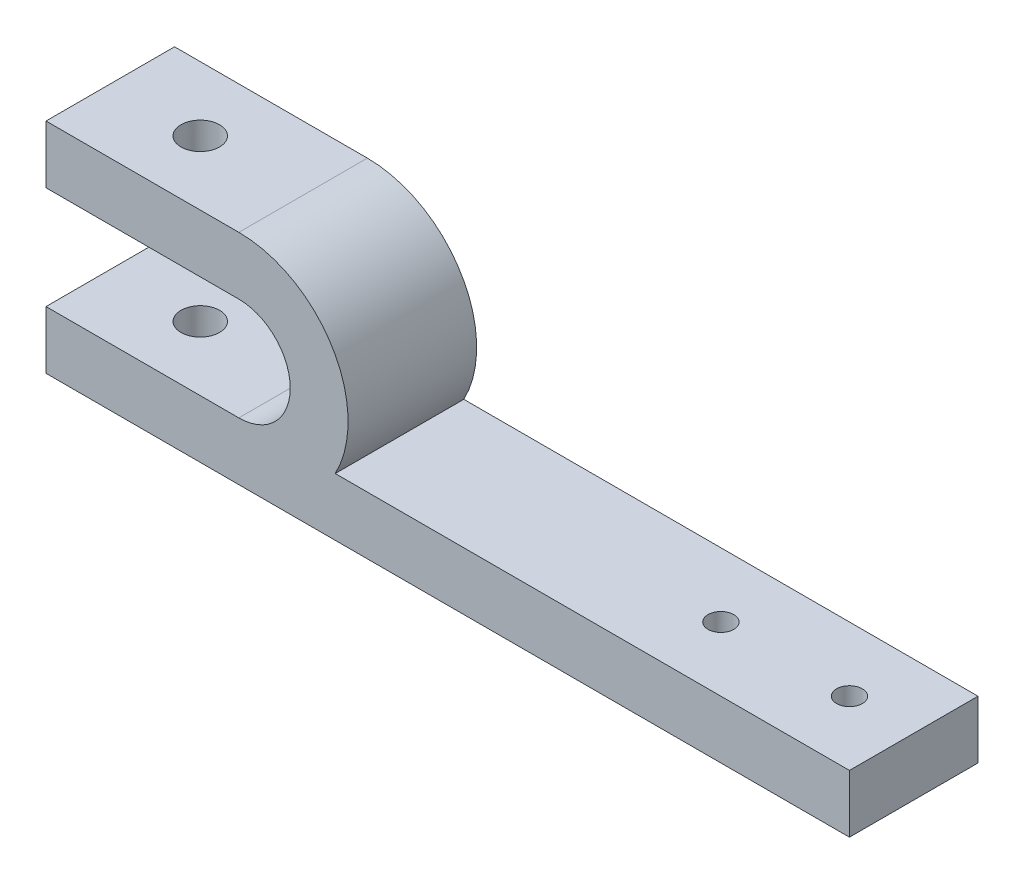
ISO-10303-21;
HEADER;
FILE_DESCRIPTION(('STEP AP214'),'2;1');
FILE_NAME('part.step','',(''),(''),'','','');
FILE_SCHEMA(('AUTOMOTIVE_DESIGN { 1 0 10303 214 1 1 1 1 }'));
ENDSEC;
DATA;
#1=APPLICATION_CONTEXT('core data for automotive mechanical design processes');
#2=APPLICATION_PROTOCOL_DEFINITION('international standard','automotive_design',2000,#1);
#3=PRODUCT_CONTEXT('',#1,'mechanical');
#4=PRODUCT('Part','Part','',(#3));
#5=PRODUCT_RELATED_PRODUCT_CATEGORY('part','',(#4));
#6=PRODUCT_DEFINITION_FORMATION('','',#4);
#7=PRODUCT_DEFINITION_CONTEXT('part definition',#1,'design');
#8=PRODUCT_DEFINITION('design','',#6,#7);
#9=PRODUCT_DEFINITION_SHAPE('','',#8);
#10=(LENGTH_UNIT() NAMED_UNIT(*) SI_UNIT(.MILLI.,.METRE.));
#11=(NAMED_UNIT(*) PLANE_ANGLE_UNIT() SI_UNIT($,.RADIAN.));
#12=(NAMED_UNIT(*) SI_UNIT($,.STERADIAN.) SOLID_ANGLE_UNIT());
#13=UNCERTAINTY_MEASURE_WITH_UNIT(LENGTH_MEASURE(1.E-05),#10,'distance_accuracy_value','');
#14=(GEOMETRIC_REPRESENTATION_CONTEXT(3) GLOBAL_UNCERTAINTY_ASSIGNED_CONTEXT((#13)) GLOBAL_UNIT_ASSIGNED_CONTEXT((#10,
#11,#12)) REPRESENTATION_CONTEXT('',''));
#15=CARTESIAN_POINT('',(0.,0.,0.));
#16=DIRECTION('',(0.,0.,1.));
#17=DIRECTION('',(1.,0.,0.));
#18=AXIS2_PLACEMENT_3D('',#15,#16,#17);
#19=CARTESIAN_POINT('',(0.,0.,10.));
#20=DIRECTION('',(0.,0.,-1.));
#21=DIRECTION('',(-1.,0.,0.));
#22=AXIS2_PLACEMENT_3D('',#19,#20,#21);
#23=CYLINDRICAL_SURFACE('',#22,8.5);
#24=CARTESIAN_POINT('',(0.,0.,0.));
#25=DIRECTION('',(0.,0.,1.));
#26=DIRECTION('',(1.,0.,0.));
#27=AXIS2_PLACEMENT_3D('',#24,#25,#26);
#28=CIRCLE('',#27,8.5);
#29=CARTESIAN_POINT('',(7.5,-4.,0.));
#30=VERTEX_POINT('',#29);
#31=CARTESIAN_POINT('',(0.,8.5,0.));
#32=VERTEX_POINT('',#31);
#33=EDGE_CURVE('E145',#30,#32,#28,.T.);
#34=ORIENTED_EDGE('',*,*,#33,.T.);
#35=DIRECTION('',(0.,0.,-1.));
#36=VECTOR('',#35,1.);
#37=CARTESIAN_POINT('',(0.,8.5,10.));
#38=LINE('',#37,#36);
#39=CARTESIAN_POINT('',(0.,8.5,10.));
#40=VERTEX_POINT('',#39);
#41=EDGE_CURVE('E11',#40,#32,#38,.T.);
#42=ORIENTED_EDGE('',*,*,#41,.F.);
#43=CARTESIAN_POINT('',(0.,0.,10.));
#44=DIRECTION('',(0.,0.,1.));
#45=DIRECTION('',(1.,0.,0.));
#46=AXIS2_PLACEMENT_3D('',#43,#44,#45);
#47=CIRCLE('',#46,8.5);
#48=CARTESIAN_POINT('',(7.5,-4.,10.));
#49=VERTEX_POINT('',#48);
#50=EDGE_CURVE('E164',#49,#40,#47,.T.);
#51=ORIENTED_EDGE('',*,*,#50,.F.);
#52=DIRECTION('',(0.,0.,-1.));
#53=VECTOR('',#52,1.);
#54=CARTESIAN_POINT('',(7.5,-4.,10.));
#55=LINE('',#54,#53);
#56=EDGE_CURVE('E141',#49,#30,#55,.T.);
#57=ORIENTED_EDGE('',*,*,#56,.T.);
#58=EDGE_LOOP('',(#34,#42,#51,#57));
#59=FACE_BOUND('',#58,.T.);
#60=ADVANCED_FACE('F35',(#59),#23,.T.);
#61=CARTESIAN_POINT('',(-15.,8.5,10.));
#62=DIRECTION('',(0.,-1.,0.));
#63=DIRECTION('',(0.,0.,-1.));
#64=AXIS2_PLACEMENT_3D('',#61,#62,#63);
#65=PLANE('',#64);
#66=CARTESIAN_POINT('',(-8.,8.5,5.));
#67=DIRECTION('',(0.,-1.,0.));
#68=DIRECTION('',(1.,0.,0.));
#69=AXIS2_PLACEMENT_3D('',#66,#67,#68);
#70=CIRCLE('',#69,1.5);
#71=CARTESIAN_POINT('',(-6.5,8.5,5.));
#72=VERTEX_POINT('',#71);
#73=EDGE_CURVE('E275',#72,#72,#70,.T.);
#74=ORIENTED_EDGE('',*,*,#73,.T.);
#75=EDGE_LOOP('',(#74));
#76=FACE_BOUND('',#75,.T.);
#77=DIRECTION('',(-1.,0.,0.));
#78=VECTOR('',#77,1.);
#79=CARTESIAN_POINT('',(-15.,8.5,0.));
#80=LINE('',#79,#78);
#81=CARTESIAN_POINT('',(-15.,8.5,0.));
#82=VERTEX_POINT('',#81);
#83=EDGE_CURVE('E148',#32,#82,#80,.T.);
#84=ORIENTED_EDGE('',*,*,#83,.T.);
#85=DIRECTION('',(0.,0.,-1.));
#86=VECTOR('',#85,1.);
#87=CARTESIAN_POINT('',(-15.,8.5,10.));
#88=LINE('',#87,#86);
#89=CARTESIAN_POINT('',(-15.,8.5,10.));
#90=VERTEX_POINT('',#89);
#91=EDGE_CURVE('E44',#90,#82,#88,.T.);
#92=ORIENTED_EDGE('',*,*,#91,.F.);
#93=DIRECTION('',(-1.,0.,0.));
#94=VECTOR('',#93,1.);
#95=CARTESIAN_POINT('',(-15.,8.5,10.));
#96=LINE('',#95,#94);
#97=EDGE_CURVE('E102',#40,#90,#96,.T.);
#98=ORIENTED_EDGE('',*,*,#97,.F.);
#99=ORIENTED_EDGE('',*,*,#41,.T.);
#100=EDGE_LOOP('',(#84,#92,#98,#99));
#101=FACE_BOUND('',#100,.T.);
#102=ADVANCED_FACE('F232',(#76,#101),#65,.F.);
#103=CARTESIAN_POINT('',(-15.,4.,10.));
#104=DIRECTION('',(1.,0.,0.));
#105=DIRECTION('',(0.,0.,-1.));
#106=AXIS2_PLACEMENT_3D('',#103,#104,#105);
#107=PLANE('',#106);
#108=DIRECTION('',(0.,-1.,0.));
#109=VECTOR('',#108,1.);
#110=CARTESIAN_POINT('',(-15.,4.,0.));
#111=LINE('',#110,#109);
#112=CARTESIAN_POINT('',(-15.,4.,0.));
#113=VERTEX_POINT('',#112);
#114=EDGE_CURVE('E151',#82,#113,#111,.T.);
#115=ORIENTED_EDGE('',*,*,#114,.T.);
#116=DIRECTION('',(0.,0.,-1.));
#117=VECTOR('',#116,1.);
#118=CARTESIAN_POINT('',(-15.,4.,10.));
#119=LINE('',#118,#117);
#120=CARTESIAN_POINT('',(-15.,4.,10.));
#121=VERTEX_POINT('',#120);
#122=EDGE_CURVE('E177',#121,#113,#119,.T.);
#123=ORIENTED_EDGE('',*,*,#122,.F.);
#124=DIRECTION('',(0.,-1.,0.));
#125=VECTOR('',#124,1.);
#126=CARTESIAN_POINT('',(-15.,4.,10.));
#127=LINE('',#126,#125);
#128=EDGE_CURVE('E196',#90,#121,#127,.T.);
#129=ORIENTED_EDGE('',*,*,#128,.F.);
#130=ORIENTED_EDGE('',*,*,#91,.T.);
#131=EDGE_LOOP('',(#115,#123,#129,#130));
#132=FACE_BOUND('',#131,.T.);
#133=ADVANCED_FACE('F236',(#132),#107,.F.);
#134=CARTESIAN_POINT('',(0.,4.,10.));
#135=DIRECTION('',(0.,1.,0.));
#136=DIRECTION('',(-1.,0.,0.));
#137=AXIS2_PLACEMENT_3D('',#134,#135,#136);
#138=PLANE('',#137);
#139=CARTESIAN_POINT('',(-8.,4.,5.));
#140=DIRECTION('',(0.,1.,0.));
#141=DIRECTION('',(-1.,0.,0.));
#142=AXIS2_PLACEMENT_3D('',#139,#140,#141);
#143=CIRCLE('',#142,1.5);
#144=CARTESIAN_POINT('',(-9.5,4.,5.));
#145=VERTEX_POINT('',#144);
#146=EDGE_CURVE('E270',#145,#145,#143,.T.);
#147=ORIENTED_EDGE('',*,*,#146,.T.);
#148=EDGE_LOOP('',(#147));
#149=FACE_BOUND('',#148,.T.);
#150=DIRECTION('',(1.,0.,0.));
#151=VECTOR('',#150,1.);
#152=CARTESIAN_POINT('',(0.,4.,0.));
#153=LINE('',#152,#151);
#154=CARTESIAN_POINT('',(0.,4.,0.));
#155=VERTEX_POINT('',#154);
#156=EDGE_CURVE('E153',#113,#155,#153,.T.);
#157=ORIENTED_EDGE('',*,*,#156,.T.);
#158=DIRECTION('',(0.,0.,-1.));
#159=VECTOR('',#158,1.);
#160=CARTESIAN_POINT('',(0.,4.,10.));
#161=LINE('',#160,#159);
#162=CARTESIAN_POINT('',(0.,4.,10.));
#163=VERTEX_POINT('',#162);
#164=EDGE_CURVE('E174',#163,#155,#161,.T.);
#165=ORIENTED_EDGE('',*,*,#164,.F.);
#166=DIRECTION('',(1.,0.,0.));
#167=VECTOR('',#166,1.);
#168=CARTESIAN_POINT('',(0.,4.,10.));
#169=LINE('',#168,#167);
#170=EDGE_CURVE('E198',#121,#163,#169,.T.);
#171=ORIENTED_EDGE('',*,*,#170,.F.);
#172=ORIENTED_EDGE('',*,*,#122,.T.);
#173=EDGE_LOOP('',(#157,#165,#171,#172));
#174=FACE_BOUND('',#173,.T.);
#175=ADVANCED_FACE('F241',(#149,#174),#138,.F.);
#176=CARTESIAN_POINT('',(0.,0.,10.));
#177=DIRECTION('',(0.,0.,-1.));
#178=DIRECTION('',(-1.,0.,0.));
#179=AXIS2_PLACEMENT_3D('',#176,#177,#178);
#180=CYLINDRICAL_SURFACE('',#179,4.);
#181=CARTESIAN_POINT('',(0.,0.,0.));
#182=DIRECTION('',(0.,0.,-1.));
#183=DIRECTION('',(1.,0.,0.));
#184=AXIS2_PLACEMENT_3D('',#181,#182,#183);
#185=CIRCLE('',#184,4.);
#186=CARTESIAN_POINT('',(0.,-4.,0.));
#187=VERTEX_POINT('',#186);
#188=EDGE_CURVE('E155',#155,#187,#185,.T.);
#189=ORIENTED_EDGE('',*,*,#188,.T.);
#190=DIRECTION('',(0.,0.,-1.));
#191=VECTOR('',#190,1.);
#192=CARTESIAN_POINT('',(0.,-4.,10.));
#193=LINE('',#192,#191);
#194=CARTESIAN_POINT('',(0.,-4.,10.));
#195=VERTEX_POINT('',#194);
#196=EDGE_CURVE('E171',#195,#187,#193,.T.);
#197=ORIENTED_EDGE('',*,*,#196,.F.);
#198=CARTESIAN_POINT('',(0.,0.,10.));
#199=DIRECTION('',(0.,0.,-1.));
#200=DIRECTION('',(1.,0.,0.));
#201=AXIS2_PLACEMENT_3D('',#198,#199,#200);
#202=CIRCLE('',#201,4.);
#203=EDGE_CURVE('E200',#163,#195,#202,.T.);
#204=ORIENTED_EDGE('',*,*,#203,.F.);
#205=ORIENTED_EDGE('',*,*,#164,.T.);
#206=EDGE_LOOP('',(#189,#197,#204,#205));
#207=FACE_BOUND('',#206,.T.);
#208=ADVANCED_FACE('F248',(#207),#180,.F.);
#209=CARTESIAN_POINT('',(-15.,-4.,10.));
#210=DIRECTION('',(0.,-1.,0.));
#211=DIRECTION('',(0.,0.,-1.));
#212=AXIS2_PLACEMENT_3D('',#209,#210,#211);
#213=PLANE('',#212);
#214=CARTESIAN_POINT('',(-8.,-4.,5.));
#215=DIRECTION('',(0.,-1.,0.));
#216=DIRECTION('',(0.,0.,-1.));
#217=AXIS2_PLACEMENT_3D('',#214,#215,#216);
#218=CIRCLE('',#217,1.5);
#219=CARTESIAN_POINT('',(-8.,-4.,3.5));
#220=VERTEX_POINT('',#219);
#221=EDGE_CURVE('E272',#220,#220,#218,.T.);
#222=ORIENTED_EDGE('',*,*,#221,.T.);
#223=EDGE_LOOP('',(#222));
#224=FACE_BOUND('',#223,.T.);
#225=DIRECTION('',(-1.,0.,0.));
#226=VECTOR('',#225,1.);
#227=CARTESIAN_POINT('',(-15.,-4.,0.));
#228=LINE('',#227,#226);
#229=CARTESIAN_POINT('',(-15.,-4.,0.));
#230=VERTEX_POINT('',#229);
#231=EDGE_CURVE('E157',#187,#230,#228,.T.);
#232=ORIENTED_EDGE('',*,*,#231,.T.);
#233=DIRECTION('',(0.,0.,-1.));
#234=VECTOR('',#233,1.);
#235=CARTESIAN_POINT('',(-15.,-4.,10.));
#236=LINE('',#235,#234);
#237=CARTESIAN_POINT('',(-15.,-4.,10.));
#238=VERTEX_POINT('',#237);
#239=EDGE_CURVE('E168',#238,#230,#236,.T.);
#240=ORIENTED_EDGE('',*,*,#239,.F.);
#241=DIRECTION('',(-1.,0.,0.));
#242=VECTOR('',#241,1.);
#243=CARTESIAN_POINT('',(-15.,-4.,10.));
#244=LINE('',#243,#242);
#245=EDGE_CURVE('E202',#195,#238,#244,.T.);
#246=ORIENTED_EDGE('',*,*,#245,.F.);
#247=ORIENTED_EDGE('',*,*,#196,.T.);
#248=EDGE_LOOP('',(#232,#240,#246,#247));
#249=FACE_BOUND('',#248,.T.);
#250=ADVANCED_FACE('F208',(#224,#249),#213,.F.);
#251=CARTESIAN_POINT('',(-15.,-8.5,10.));
#252=DIRECTION('',(1.,0.,0.));
#253=DIRECTION('',(0.,0.,-1.));
#254=AXIS2_PLACEMENT_3D('',#251,#252,#253);
#255=PLANE('',#254);
#256=DIRECTION('',(0.,-1.,0.));
#257=VECTOR('',#256,1.);
#258=CARTESIAN_POINT('',(-15.,-8.5,0.));
#259=LINE('',#258,#257);
#260=CARTESIAN_POINT('',(-15.,-8.5,0.));
#261=VERTEX_POINT('',#260);
#262=EDGE_CURVE('E159',#230,#261,#259,.T.);
#263=ORIENTED_EDGE('',*,*,#262,.T.);
#264=DIRECTION('',(0.,0.,-1.));
#265=VECTOR('',#264,1.);
#266=CARTESIAN_POINT('',(-15.,-8.5,10.));
#267=LINE('',#266,#265);
#268=CARTESIAN_POINT('',(-15.,-8.5,10.));
#269=VERTEX_POINT('',#268);
#270=EDGE_CURVE('E136',#269,#261,#267,.T.);
#271=ORIENTED_EDGE('',*,*,#270,.F.);
#272=DIRECTION('',(0.,-1.,0.));
#273=VECTOR('',#272,1.);
#274=CARTESIAN_POINT('',(-15.,-8.5,10.));
#275=LINE('',#274,#273);
#276=EDGE_CURVE('E127',#238,#269,#275,.T.);
#277=ORIENTED_EDGE('',*,*,#276,.F.);
#278=ORIENTED_EDGE('',*,*,#239,.T.);
#279=EDGE_LOOP('',(#263,#271,#277,#278));
#280=FACE_BOUND('',#279,.T.);
#281=ADVANCED_FACE('F212',(#280),#255,.F.);
#282=CARTESIAN_POINT('',(47.5,-8.49999999999999,10.));
#283=DIRECTION('',(0.,1.,0.));
#284=DIRECTION('',(-1.,0.,0.));
#285=AXIS2_PLACEMENT_3D('',#282,#283,#284);
#286=PLANE('',#285);
#287=CARTESIAN_POINT('',(-8.,-8.5,5.));
#288=DIRECTION('',(0.,-1.,0.));
#289=DIRECTION('',(1.,0.,0.));
#290=AXIS2_PLACEMENT_3D('',#287,#288,#289);
#291=CIRCLE('',#290,1.5);
#292=CARTESIAN_POINT('',(-6.5,-8.5,5.));
#293=VERTEX_POINT('',#292);
#294=EDGE_CURVE('E265',#293,#293,#291,.T.);
#295=ORIENTED_EDGE('',*,*,#294,.F.);
#296=EDGE_LOOP('',(#295));
#297=FACE_BOUND('',#296,.T.);
#298=CARTESIAN_POINT('',(32.5,-8.5,5.));
#299=DIRECTION('',(0.,-1.,0.));
#300=DIRECTION('',(1.,0.,0.));
#301=AXIS2_PLACEMENT_3D('',#298,#299,#300);
#302=CIRCLE('',#301,0.999999999999998);
#303=CARTESIAN_POINT('',(33.5,-8.5,5.));
#304=VERTEX_POINT('',#303);
#305=EDGE_CURVE('E190',#304,#304,#302,.T.);
#306=ORIENTED_EDGE('',*,*,#305,.F.);
#307=EDGE_LOOP('',(#306));
#308=FACE_BOUND('',#307,.T.);
#309=CARTESIAN_POINT('',(42.5,-8.5,5.));
#310=DIRECTION('',(0.,-1.,0.));
#311=DIRECTION('',(1.,0.,0.));
#312=AXIS2_PLACEMENT_3D('',#309,#310,#311);
#313=CIRCLE('',#312,0.999999999999998);
#314=CARTESIAN_POINT('',(43.5,-8.5,5.));
#315=VERTEX_POINT('',#314);
#316=EDGE_CURVE('E182',#315,#315,#313,.T.);
#317=ORIENTED_EDGE('',*,*,#316,.F.);
#318=EDGE_LOOP('',(#317));
#319=FACE_BOUND('',#318,.T.);
#320=DIRECTION('',(1.,0.,0.));
#321=VECTOR('',#320,1.);
#322=CARTESIAN_POINT('',(47.5,-8.49999999999999,0.));
#323=LINE('',#322,#321);
#324=CARTESIAN_POINT('',(47.5,-8.49999999999999,0.));
#325=VERTEX_POINT('',#324);
#326=EDGE_CURVE('E135',#261,#325,#323,.T.);
#327=ORIENTED_EDGE('',*,*,#326,.T.);
#328=DIRECTION('',(0.,0.,-1.));
#329=VECTOR('',#328,1.);
#330=CARTESIAN_POINT('',(47.5,-8.49999999999999,10.));
#331=LINE('',#330,#329);
#332=CARTESIAN_POINT('',(47.5,-8.49999999999999,10.));
#333=VERTEX_POINT('',#332);
#334=EDGE_CURVE('E132',#333,#325,#331,.T.);
#335=ORIENTED_EDGE('',*,*,#334,.F.);
#336=DIRECTION('',(1.,0.,0.));
#337=VECTOR('',#336,1.);
#338=CARTESIAN_POINT('',(47.5,-8.49999999999999,10.));
#339=LINE('',#338,#337);
#340=EDGE_CURVE('E121',#269,#333,#339,.T.);
#341=ORIENTED_EDGE('',*,*,#340,.F.);
#342=ORIENTED_EDGE('',*,*,#270,.T.);
#343=EDGE_LOOP('',(#327,#335,#341,#342));
#344=FACE_BOUND('',#343,.T.);
#345=ADVANCED_FACE('F133',(#297,#308,#319,#344),#286,.F.);
#346=CARTESIAN_POINT('',(47.5,-4.,10.));
#347=DIRECTION('',(-1.,0.,0.));
#348=DIRECTION('',(0.,0.,1.));
#349=AXIS2_PLACEMENT_3D('',#346,#347,#348);
#350=PLANE('',#349);
#351=DIRECTION('',(0.,1.,0.));
#352=VECTOR('',#351,1.);
#353=CARTESIAN_POINT('',(47.5,-4.,0.));
#354=LINE('',#353,#352);
#355=CARTESIAN_POINT('',(47.5,-4.,0.));
#356=VERTEX_POINT('',#355);
#357=EDGE_CURVE('E88',#325,#356,#354,.T.);
#358=ORIENTED_EDGE('',*,*,#357,.T.);
#359=DIRECTION('',(0.,0.,-1.));
#360=VECTOR('',#359,1.);
#361=CARTESIAN_POINT('',(47.5,-4.,10.));
#362=LINE('',#361,#360);
#363=CARTESIAN_POINT('',(47.5,-4.,10.));
#364=VERTEX_POINT('',#363);
#365=EDGE_CURVE('E137',#364,#356,#362,.T.);
#366=ORIENTED_EDGE('',*,*,#365,.F.);
#367=DIRECTION('',(0.,1.,0.));
#368=VECTOR('',#367,1.);
#369=CARTESIAN_POINT('',(47.5,-4.,10.));
#370=LINE('',#369,#368);
#371=EDGE_CURVE('E125',#333,#364,#370,.T.);
#372=ORIENTED_EDGE('',*,*,#371,.F.);
#373=ORIENTED_EDGE('',*,*,#334,.T.);
#374=EDGE_LOOP('',(#358,#366,#372,#373));
#375=FACE_BOUND('',#374,.T.);
#376=ADVANCED_FACE('F139',(#375),#350,.F.);
#377=CARTESIAN_POINT('',(7.5,-4.,10.));
#378=DIRECTION('',(0.,-1.,0.));
#379=DIRECTION('',(0.,0.,-1.));
#380=AXIS2_PLACEMENT_3D('',#377,#378,#379);
#381=PLANE('',#380);
#382=CARTESIAN_POINT('',(32.5,-4.,5.));
#383=DIRECTION('',(0.,-1.,0.));
#384=DIRECTION('',(0.,0.,-1.));
#385=AXIS2_PLACEMENT_3D('',#382,#383,#384);
#386=CIRCLE('',#385,0.999999999999998);
#387=CARTESIAN_POINT('',(32.5,-4.,4.));
#388=VERTEX_POINT('',#387);
#389=EDGE_CURVE('E38',#388,#388,#386,.T.);
#390=ORIENTED_EDGE('',*,*,#389,.T.);
#391=EDGE_LOOP('',(#390));
#392=FACE_BOUND('',#391,.T.);
#393=CARTESIAN_POINT('',(42.5,-4.,5.));
#394=DIRECTION('',(0.,-1.,0.));
#395=DIRECTION('',(0.,0.,-1.));
#396=AXIS2_PLACEMENT_3D('',#393,#394,#395);
#397=CIRCLE('',#396,0.999999999999998);
#398=CARTESIAN_POINT('',(42.5,-4.,4.));
#399=VERTEX_POINT('',#398);
#400=EDGE_CURVE('E149',#399,#399,#397,.T.);
#401=ORIENTED_EDGE('',*,*,#400,.T.);
#402=EDGE_LOOP('',(#401));
#403=FACE_BOUND('',#402,.T.);
#404=DIRECTION('',(-1.,0.,0.));
#405=VECTOR('',#404,1.);
#406=CARTESIAN_POINT('',(7.5,-4.,0.));
#407=LINE('',#406,#405);
#408=EDGE_CURVE('E94',#356,#30,#407,.T.);
#409=ORIENTED_EDGE('',*,*,#408,.T.);
#410=ORIENTED_EDGE('',*,*,#56,.F.);
#411=DIRECTION('',(-1.,0.,0.));
#412=VECTOR('',#411,1.);
#413=CARTESIAN_POINT('',(7.5,-4.,10.));
#414=LINE('',#413,#412);
#415=EDGE_CURVE('E53',#364,#49,#414,.T.);
#416=ORIENTED_EDGE('',*,*,#415,.F.);
#417=ORIENTED_EDGE('',*,*,#365,.T.);
#418=EDGE_LOOP('',(#409,#410,#416,#417));
#419=FACE_BOUND('',#418,.T.);
#420=ADVANCED_FACE('F220',(#392,#403,#419),#381,.F.);
#421=CARTESIAN_POINT('',(0.,0.,10.));
#422=DIRECTION('',(0.,0.,1.));
#423=DIRECTION('',(1.,0.,0.));
#424=AXIS2_PLACEMENT_3D('',#421,#422,#423);
#425=PLANE('',#424);
#426=ORIENTED_EDGE('',*,*,#50,.T.);
#427=ORIENTED_EDGE('',*,*,#97,.T.);
#428=ORIENTED_EDGE('',*,*,#128,.T.);
#429=ORIENTED_EDGE('',*,*,#170,.T.);
#430=ORIENTED_EDGE('',*,*,#203,.T.);
#431=ORIENTED_EDGE('',*,*,#245,.T.);
#432=ORIENTED_EDGE('',*,*,#276,.T.);
#433=ORIENTED_EDGE('',*,*,#340,.T.);
#434=ORIENTED_EDGE('',*,*,#371,.T.);
#435=ORIENTED_EDGE('',*,*,#415,.T.);
#436=EDGE_LOOP('',(#426,#427,#428,#429,#430,#431,#432,#433,#434,#435));
#437=FACE_BOUND('',#436,.T.);
#438=ADVANCED_FACE('F123',(#437),#425,.T.);
#439=CARTESIAN_POINT('',(0.,0.,0.));
#440=DIRECTION('',(0.,0.,1.));
#441=DIRECTION('',(1.,0.,0.));
#442=AXIS2_PLACEMENT_3D('',#439,#440,#441);
#443=PLANE('',#442);
#444=ORIENTED_EDGE('',*,*,#33,.F.);
#445=ORIENTED_EDGE('',*,*,#408,.F.);
#446=ORIENTED_EDGE('',*,*,#357,.F.);
#447=ORIENTED_EDGE('',*,*,#326,.F.);
#448=ORIENTED_EDGE('',*,*,#262,.F.);
#449=ORIENTED_EDGE('',*,*,#231,.F.);
#450=ORIENTED_EDGE('',*,*,#188,.F.);
#451=ORIENTED_EDGE('',*,*,#156,.F.);
#452=ORIENTED_EDGE('',*,*,#114,.F.);
#453=ORIENTED_EDGE('',*,*,#83,.F.);
#454=EDGE_LOOP('',(#444,#445,#446,#447,#448,#449,#450,#451,#452,#453));
#455=FACE_BOUND('',#454,.T.);
#456=ADVANCED_FACE('F215',(#455),#443,.F.);
#457=CARTESIAN_POINT('',(42.5,8.50000000000001,5.));
#458=DIRECTION('',(0.,-1.,0.));
#459=DIRECTION('',(1.,0.,0.));
#460=AXIS2_PLACEMENT_3D('',#457,#458,#459);
#461=CYLINDRICAL_SURFACE('',#460,0.999999999999998);
#462=ORIENTED_EDGE('',*,*,#316,.T.);
#463=EDGE_LOOP('',(#462));
#464=FACE_BOUND('',#463,.T.);
#465=ORIENTED_EDGE('',*,*,#400,.F.);
#466=EDGE_LOOP('',(#465));
#467=FACE_BOUND('',#466,.T.);
#468=ADVANCED_FACE('F294',(#464,#467),#461,.F.);
#469=CARTESIAN_POINT('',(32.5,8.50000000000001,5.));
#470=DIRECTION('',(0.,-1.,0.));
#471=DIRECTION('',(1.,0.,0.));
#472=AXIS2_PLACEMENT_3D('',#469,#470,#471);
#473=CYLINDRICAL_SURFACE('',#472,0.999999999999998);
#474=ORIENTED_EDGE('',*,*,#305,.T.);
#475=EDGE_LOOP('',(#474));
#476=FACE_BOUND('',#475,.T.);
#477=ORIENTED_EDGE('',*,*,#389,.F.);
#478=EDGE_LOOP('',(#477));
#479=FACE_BOUND('',#478,.T.);
#480=ADVANCED_FACE('F289',(#476,#479),#473,.F.);
#481=CARTESIAN_POINT('',(-8.,8.5,5.));
#482=DIRECTION('',(0.,-1.,0.));
#483=DIRECTION('',(1.,0.,0.));
#484=AXIS2_PLACEMENT_3D('',#481,#482,#483);
#485=CYLINDRICAL_SURFACE('',#484,1.5);
#486=ORIENTED_EDGE('',*,*,#294,.T.);
#487=EDGE_LOOP('',(#486));
#488=FACE_BOUND('',#487,.T.);
#489=ORIENTED_EDGE('',*,*,#221,.F.);
#490=EDGE_LOOP('',(#489));
#491=FACE_BOUND('',#490,.T.);
#492=ADVANCED_FACE('F284',(#488,#491),#485,.F.);
#493=ORIENTED_EDGE('',*,*,#73,.F.);
#494=EDGE_LOOP('',(#493));
#495=FACE_BOUND('',#494,.T.);
#496=ORIENTED_EDGE('',*,*,#146,.F.);
#497=EDGE_LOOP('',(#496));
#498=FACE_BOUND('',#497,.T.);
#499=ADVANCED_FACE('F281',(#495,#498),#485,.F.);
#500=CLOSED_SHELL('',(#60,#102,#133,#175,#208,#250,#281,#345,#376,#420,#438,#456,#468,#480,#492,#499));
#501=MANIFOLD_SOLID_BREP('B2',#500);
#502=ADVANCED_BREP_SHAPE_REPRESENTATION('',(#18,#501),#14);
#503=SHAPE_DEFINITION_REPRESENTATION(#9,#502);
ENDSEC;
END-ISO-10303-21;
